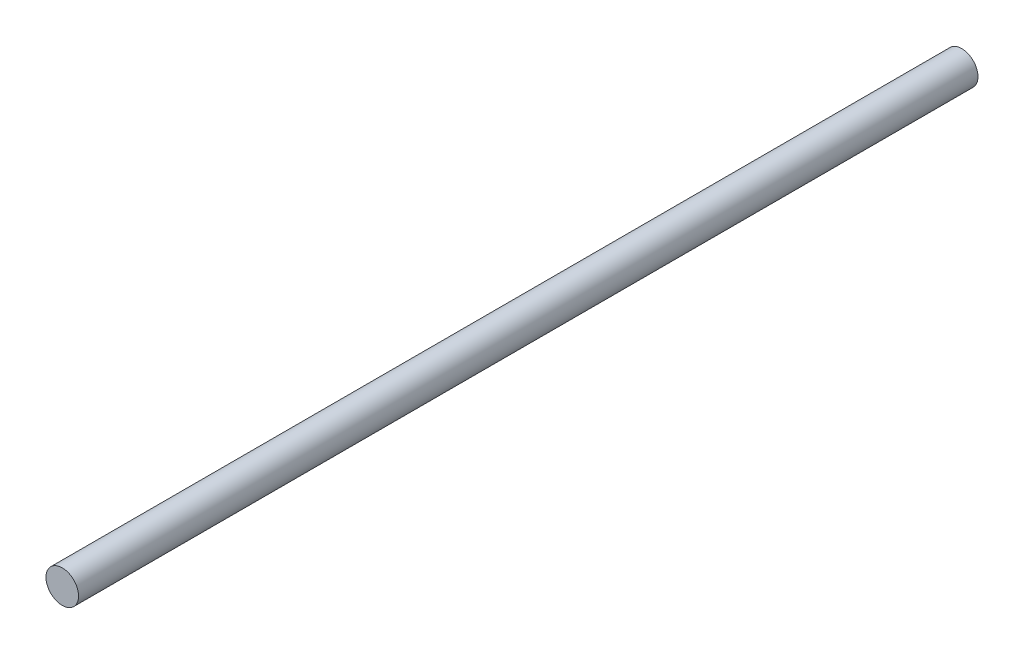
ISO-10303-21;
HEADER;
FILE_DESCRIPTION(('STEP AP214'),'2;1');
FILE_NAME('part.step','',(''),(''),'','','');
FILE_SCHEMA(('AUTOMOTIVE_DESIGN { 1 0 10303 214 1 1 1 1 }'));
ENDSEC;
DATA;
#1=APPLICATION_CONTEXT('core data for automotive mechanical design processes');
#2=APPLICATION_PROTOCOL_DEFINITION('international standard','automotive_design',2000,#1);
#3=PRODUCT_CONTEXT('',#1,'mechanical');
#4=PRODUCT('Part','Part','',(#3));
#5=PRODUCT_RELATED_PRODUCT_CATEGORY('part','',(#4));
#6=PRODUCT_DEFINITION_FORMATION('','',#4);
#7=PRODUCT_DEFINITION_CONTEXT('part definition',#1,'design');
#8=PRODUCT_DEFINITION('design','',#6,#7);
#9=PRODUCT_DEFINITION_SHAPE('','',#8);
#10=(LENGTH_UNIT() NAMED_UNIT(*) SI_UNIT(.MILLI.,.METRE.));
#11=(NAMED_UNIT(*) PLANE_ANGLE_UNIT() SI_UNIT($,.RADIAN.));
#12=(NAMED_UNIT(*) SI_UNIT($,.STERADIAN.) SOLID_ANGLE_UNIT());
#13=UNCERTAINTY_MEASURE_WITH_UNIT(LENGTH_MEASURE(1.E-05),#10,'distance_accuracy_value','');
#14=(GEOMETRIC_REPRESENTATION_CONTEXT(3) GLOBAL_UNCERTAINTY_ASSIGNED_CONTEXT((#13)) GLOBAL_UNIT_ASSIGNED_CONTEXT((#10,
#11,#12)) REPRESENTATION_CONTEXT('',''));
#15=CARTESIAN_POINT('',(0.,0.,0.));
#16=DIRECTION('',(0.,0.,1.));
#17=DIRECTION('',(1.,0.,0.));
#18=AXIS2_PLACEMENT_3D('',#15,#16,#17);
#19=CARTESIAN_POINT('',(0.,0.,175.26));
#20=DIRECTION('',(0.,0.,-1.));
#21=DIRECTION('',(-1.,0.,0.));
#22=AXIS2_PLACEMENT_3D('',#19,#20,#21);
#23=CYLINDRICAL_SURFACE('',#22,3.175);
#24=CARTESIAN_POINT('',(0.,0.,175.26));
#25=DIRECTION('',(0.,0.,1.));
#26=DIRECTION('',(1.,0.,0.));
#27=AXIS2_PLACEMENT_3D('',#24,#25,#26);
#28=CIRCLE('',#27,3.175);
#29=CARTESIAN_POINT('',(3.175,0.,175.26));
#30=VERTEX_POINT('',#29);
#31=EDGE_CURVE('E10',#30,#30,#28,.T.);
#32=ORIENTED_EDGE('',*,*,#31,.F.);
#33=EDGE_LOOP('',(#32));
#34=FACE_BOUND('',#33,.T.);
#35=CARTESIAN_POINT('',(0.,0.,0.));
#36=DIRECTION('',(0.,0.,1.));
#37=DIRECTION('',(1.,0.,0.));
#38=AXIS2_PLACEMENT_3D('',#35,#36,#37);
#39=CIRCLE('',#38,3.175);
#40=CARTESIAN_POINT('',(3.175,0.,0.));
#41=VERTEX_POINT('',#40);
#42=EDGE_CURVE('E42',#41,#41,#39,.T.);
#43=ORIENTED_EDGE('',*,*,#42,.T.);
#44=EDGE_LOOP('',(#43));
#45=FACE_BOUND('',#44,.T.);
#46=ADVANCED_FACE('F39',(#34,#45),#23,.T.);
#47=CARTESIAN_POINT('',(0.,0.,175.26));
#48=DIRECTION('',(0.,0.,1.));
#49=DIRECTION('',(1.,0.,0.));
#50=AXIS2_PLACEMENT_3D('',#47,#48,#49);
#51=PLANE('',#50);
#52=ORIENTED_EDGE('',*,*,#31,.T.);
#53=EDGE_LOOP('',(#52));
#54=FACE_BOUND('',#53,.T.);
#55=ADVANCED_FACE('F54',(#54),#51,.T.);
#56=CARTESIAN_POINT('',(0.,0.,0.));
#57=DIRECTION('',(0.,0.,1.));
#58=DIRECTION('',(1.,0.,0.));
#59=AXIS2_PLACEMENT_3D('',#56,#57,#58);
#60=PLANE('',#59);
#61=ORIENTED_EDGE('',*,*,#42,.F.);
#62=EDGE_LOOP('',(#61));
#63=FACE_BOUND('',#62,.T.);
#64=ADVANCED_FACE('F52',(#63),#60,.F.);
#65=CLOSED_SHELL('',(#46,#55,#64));
#66=MANIFOLD_SOLID_BREP('B2',#65);
#67=ADVANCED_BREP_SHAPE_REPRESENTATION('',(#18,#66),#14);
#68=SHAPE_DEFINITION_REPRESENTATION(#9,#67);
ENDSEC;
END-ISO-10303-21;
